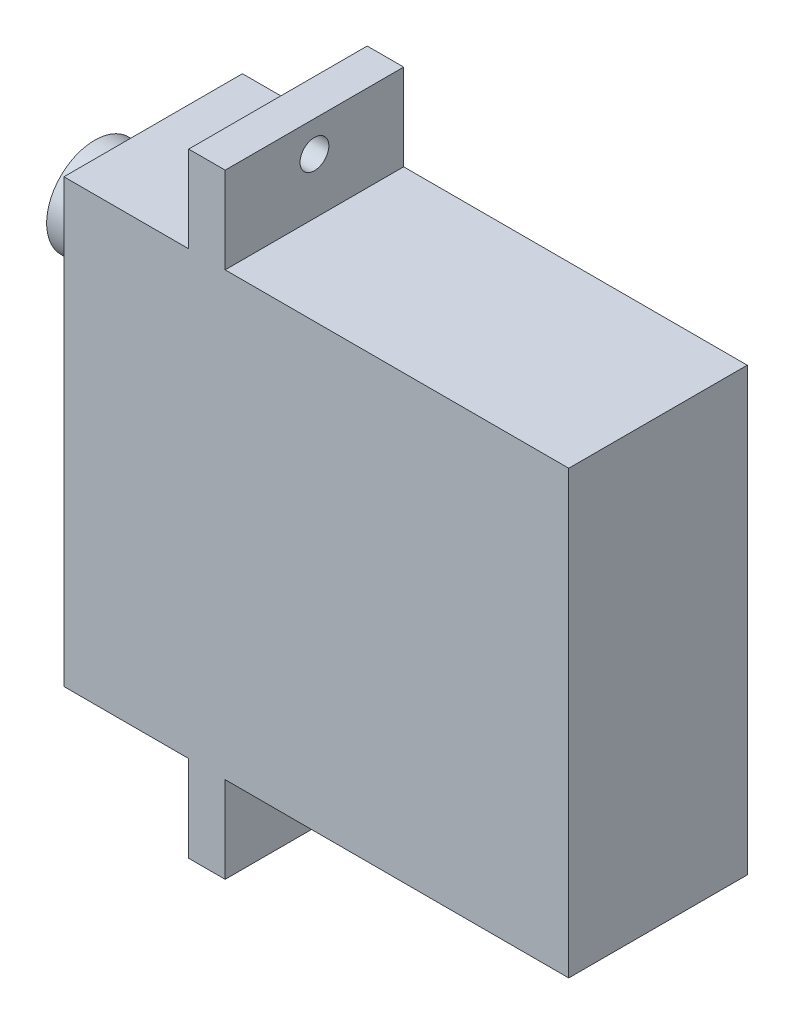
ISO-10303-21;
HEADER;
FILE_DESCRIPTION(('STEP AP214'),'2;1');
FILE_NAME('part.step','',(''),(''),'','','');
FILE_SCHEMA(('AUTOMOTIVE_DESIGN { 1 0 10303 214 1 1 1 1 }'));
ENDSEC;
DATA;
#1=APPLICATION_CONTEXT('core data for automotive mechanical design processes');
#2=APPLICATION_PROTOCOL_DEFINITION('international standard','automotive_design',2000,#1);
#3=PRODUCT_CONTEXT('',#1,'mechanical');
#4=PRODUCT('Part','Part','',(#3));
#5=PRODUCT_RELATED_PRODUCT_CATEGORY('part','',(#4));
#6=PRODUCT_DEFINITION_FORMATION('','',#4);
#7=PRODUCT_DEFINITION_CONTEXT('part definition',#1,'design');
#8=PRODUCT_DEFINITION('design','',#6,#7);
#9=PRODUCT_DEFINITION_SHAPE('','',#8);
#10=(LENGTH_UNIT() NAMED_UNIT(*) SI_UNIT(.MILLI.,.METRE.));
#11=(NAMED_UNIT(*) PLANE_ANGLE_UNIT() SI_UNIT($,.RADIAN.));
#12=(NAMED_UNIT(*) SI_UNIT($,.STERADIAN.) SOLID_ANGLE_UNIT());
#13=UNCERTAINTY_MEASURE_WITH_UNIT(LENGTH_MEASURE(1.E-05),#10,'distance_accuracy_value','');
#14=(GEOMETRIC_REPRESENTATION_CONTEXT(3) GLOBAL_UNCERTAINTY_ASSIGNED_CONTEXT((#13)) GLOBAL_UNIT_ASSIGNED_CONTEXT((#10,
#11,#12)) REPRESENTATION_CONTEXT('',''));
#15=CARTESIAN_POINT('',(0.,0.,0.));
#16=DIRECTION('',(0.,0.,1.));
#17=DIRECTION('',(1.,0.,0.));
#18=AXIS2_PLACEMENT_3D('',#15,#16,#17);
#19=CARTESIAN_POINT('',(-4.75000000000001,11.5,4.65));
#20=DIRECTION('',(0.,-1.,0.));
#21=DIRECTION('',(1.,0.,0.));
#22=AXIS2_PLACEMENT_3D('',#19,#20,#21);
#23=PLANE('',#22);
#24=DIRECTION('',(-1.,0.,0.));
#25=VECTOR('',#24,1.);
#26=CARTESIAN_POINT('',(-4.75000000000001,11.5,-4.65));
#27=LINE('',#26,#25);
#28=CARTESIAN_POINT('',(13.15,11.5,-4.65));
#29=VERTEX_POINT('',#28);
#30=CARTESIAN_POINT('',(-4.75000000000001,11.5,-4.65));
#31=VERTEX_POINT('',#30);
#32=EDGE_CURVE('E160',#29,#31,#27,.T.);
#33=ORIENTED_EDGE('',*,*,#32,.T.);
#34=DIRECTION('',(0.,0.,-1.));
#35=VECTOR('',#34,1.);
#36=CARTESIAN_POINT('',(-4.75000000000001,11.5,4.65));
#37=LINE('',#36,#35);
#38=CARTESIAN_POINT('',(-4.75000000000001,11.5,4.65));
#39=VERTEX_POINT('',#38);
#40=EDGE_CURVE('E11',#39,#31,#37,.T.);
#41=ORIENTED_EDGE('',*,*,#40,.F.);
#42=DIRECTION('',(-1.,0.,0.));
#43=VECTOR('',#42,1.);
#44=CARTESIAN_POINT('',(-4.75000000000001,11.5,4.65));
#45=LINE('',#44,#43);
#46=CARTESIAN_POINT('',(13.15,11.5,4.65));
#47=VERTEX_POINT('',#46);
#48=EDGE_CURVE('E183',#47,#39,#45,.T.);
#49=ORIENTED_EDGE('',*,*,#48,.F.);
#50=DIRECTION('',(0.,0.,-1.));
#51=VECTOR('',#50,1.);
#52=CARTESIAN_POINT('',(13.15,11.5,4.65));
#53=LINE('',#52,#51);
#54=EDGE_CURVE('E156',#47,#29,#53,.T.);
#55=ORIENTED_EDGE('',*,*,#54,.T.);
#56=EDGE_LOOP('',(#33,#41,#49,#55));
#57=FACE_BOUND('',#56,.T.);
#58=ADVANCED_FACE('F39',(#57),#23,.F.);
#59=CARTESIAN_POINT('',(-4.75000000000001,11.5,4.65));
#60=DIRECTION('',(-1.,0.,0.));
#61=DIRECTION('',(0.,0.,1.));
#62=AXIS2_PLACEMENT_3D('',#59,#60,#61);
#63=PLANE('',#62);
#64=CARTESIAN_POINT('',(-4.75000000000001,14.4,0.));
#65=DIRECTION('',(-1.,0.,0.));
#66=DIRECTION('',(0.,0.,1.));
#67=AXIS2_PLACEMENT_3D('',#64,#65,#66);
#68=CIRCLE('',#67,0.750000000000001);
#69=CARTESIAN_POINT('',(-4.75000000000001,14.4,0.750000000000001));
#70=VERTEX_POINT('',#69);
#71=EDGE_CURVE('E300',#70,#70,#68,.T.);
#72=ORIENTED_EDGE('',*,*,#71,.T.);
#73=EDGE_LOOP('',(#72));
#74=FACE_BOUND('',#73,.T.);
#75=DIRECTION('',(0.,1.,0.));
#76=VECTOR('',#75,1.);
#77=CARTESIAN_POINT('',(-4.75000000000001,11.5,-4.65));
#78=LINE('',#77,#76);
#79=CARTESIAN_POINT('',(-4.75000000000001,16.,-4.65));
#80=VERTEX_POINT('',#79);
#81=EDGE_CURVE('E163',#31,#80,#78,.T.);
#82=ORIENTED_EDGE('',*,*,#81,.T.);
#83=DIRECTION('',(0.,0.,-1.));
#84=VECTOR('',#83,1.);
#85=CARTESIAN_POINT('',(-4.75000000000001,16.,4.65));
#86=LINE('',#85,#84);
#87=CARTESIAN_POINT('',(-4.75000000000001,16.,4.65));
#88=VERTEX_POINT('',#87);
#89=EDGE_CURVE('E48',#88,#80,#86,.T.);
#90=ORIENTED_EDGE('',*,*,#89,.F.);
#91=DIRECTION('',(0.,1.,0.));
#92=VECTOR('',#91,1.);
#93=CARTESIAN_POINT('',(-4.75000000000001,11.5,4.65));
#94=LINE('',#93,#92);
#95=EDGE_CURVE('E111',#39,#88,#94,.T.);
#96=ORIENTED_EDGE('',*,*,#95,.F.);
#97=ORIENTED_EDGE('',*,*,#40,.T.);
#98=EDGE_LOOP('',(#82,#90,#96,#97));
#99=FACE_BOUND('',#98,.T.);
#100=ADVANCED_FACE('F262',(#74,#99),#63,.F.);
#101=CARTESIAN_POINT('',(-4.75000000000001,16.,4.65));
#102=DIRECTION('',(0.,-1.,0.));
#103=DIRECTION('',(1.,0.,0.));
#104=AXIS2_PLACEMENT_3D('',#101,#102,#103);
#105=PLANE('',#104);
#106=DIRECTION('',(-1.,0.,0.));
#107=VECTOR('',#106,1.);
#108=CARTESIAN_POINT('',(-4.75000000000001,16.,-4.65));
#109=LINE('',#108,#107);
#110=CARTESIAN_POINT('',(-6.65,16.,-4.65));
#111=VERTEX_POINT('',#110);
#112=EDGE_CURVE('E166',#80,#111,#109,.T.);
#113=ORIENTED_EDGE('',*,*,#112,.T.);
#114=DIRECTION('',(0.,0.,-1.));
#115=VECTOR('',#114,1.);
#116=CARTESIAN_POINT('',(-6.65,16.,4.65));
#117=LINE('',#116,#115);
#118=CARTESIAN_POINT('',(-6.65,16.,4.65));
#119=VERTEX_POINT('',#118);
#120=EDGE_CURVE('E202',#119,#111,#117,.T.);
#121=ORIENTED_EDGE('',*,*,#120,.F.);
#122=DIRECTION('',(-1.,0.,0.));
#123=VECTOR('',#122,1.);
#124=CARTESIAN_POINT('',(-4.75000000000001,16.,4.65));
#125=LINE('',#124,#123);
#126=EDGE_CURVE('E211',#88,#119,#125,.T.);
#127=ORIENTED_EDGE('',*,*,#126,.F.);
#128=ORIENTED_EDGE('',*,*,#89,.T.);
#129=EDGE_LOOP('',(#113,#121,#127,#128));
#130=FACE_BOUND('',#129,.T.);
#131=ADVANCED_FACE('F209',(#130),#105,.F.);
#132=CARTESIAN_POINT('',(-6.65,16.,4.65));
#133=DIRECTION('',(1.,0.,0.));
#134=DIRECTION('',(0.,1.,0.));
#135=AXIS2_PLACEMENT_3D('',#132,#133,#134);
#136=PLANE('',#135);
#137=CARTESIAN_POINT('',(-6.65,14.4,0.));
#138=DIRECTION('',(-1.,0.,0.));
#139=DIRECTION('',(0.,-1.,0.));
#140=AXIS2_PLACEMENT_3D('',#137,#138,#139);
#141=CIRCLE('',#140,0.750000000000001);
#142=CARTESIAN_POINT('',(-6.65,13.65,0.));
#143=VERTEX_POINT('',#142);
#144=EDGE_CURVE('E301',#143,#143,#141,.T.);
#145=ORIENTED_EDGE('',*,*,#144,.F.);
#146=EDGE_LOOP('',(#145));
#147=FACE_BOUND('',#146,.T.);
#148=DIRECTION('',(0.,-1.,0.));
#149=VECTOR('',#148,1.);
#150=CARTESIAN_POINT('',(-6.65,16.,-4.65));
#151=LINE('',#150,#149);
#152=CARTESIAN_POINT('',(-6.65,11.5,-4.65));
#153=VERTEX_POINT('',#152);
#154=EDGE_CURVE('E168',#111,#153,#151,.T.);
#155=ORIENTED_EDGE('',*,*,#154,.T.);
#156=DIRECTION('',(0.,0.,-1.));
#157=VECTOR('',#156,1.);
#158=CARTESIAN_POINT('',(-6.65,11.5,4.65));
#159=LINE('',#158,#157);
#160=CARTESIAN_POINT('',(-6.65,11.5,4.65));
#161=VERTEX_POINT('',#160);
#162=EDGE_CURVE('E199',#161,#153,#159,.T.);
#163=ORIENTED_EDGE('',*,*,#162,.F.);
#164=DIRECTION('',(0.,-1.,0.));
#165=VECTOR('',#164,1.);
#166=CARTESIAN_POINT('',(-6.65,16.,4.65));
#167=LINE('',#166,#165);
#168=EDGE_CURVE('E229',#119,#161,#167,.T.);
#169=ORIENTED_EDGE('',*,*,#168,.F.);
#170=ORIENTED_EDGE('',*,*,#120,.T.);
#171=EDGE_LOOP('',(#155,#163,#169,#170));
#172=FACE_BOUND('',#171,.T.);
#173=ADVANCED_FACE('F220',(#147,#172),#136,.F.);
#174=CARTESIAN_POINT('',(-13.15,11.5,4.65));
#175=DIRECTION('',(0.,-1.,0.));
#176=DIRECTION('',(0.,0.,-1.));
#177=AXIS2_PLACEMENT_3D('',#174,#175,#176);
#178=PLANE('',#177);
#179=DIRECTION('',(-1.,0.,0.));
#180=VECTOR('',#179,1.);
#181=CARTESIAN_POINT('',(-13.15,11.5,-4.65));
#182=LINE('',#181,#180);
#183=CARTESIAN_POINT('',(-13.15,11.5,-4.65));
#184=VERTEX_POINT('',#183);
#185=EDGE_CURVE('E170',#153,#184,#182,.T.);
#186=ORIENTED_EDGE('',*,*,#185,.T.);
#187=DIRECTION('',(0.,0.,-1.));
#188=VECTOR('',#187,1.);
#189=CARTESIAN_POINT('',(-13.15,11.5,4.65));
#190=LINE('',#189,#188);
#191=CARTESIAN_POINT('',(-13.15,11.5,4.65));
#192=VERTEX_POINT('',#191);
#193=EDGE_CURVE('E196',#192,#184,#190,.T.);
#194=ORIENTED_EDGE('',*,*,#193,.F.);
#195=DIRECTION('',(-1.,0.,0.));
#196=VECTOR('',#195,1.);
#197=CARTESIAN_POINT('',(-13.15,11.5,4.65));
#198=LINE('',#197,#196);
#199=EDGE_CURVE('E226',#161,#192,#198,.T.);
#200=ORIENTED_EDGE('',*,*,#199,.F.);
#201=ORIENTED_EDGE('',*,*,#162,.T.);
#202=EDGE_LOOP('',(#186,#194,#200,#201));
#203=FACE_BOUND('',#202,.T.);
#204=ADVANCED_FACE('F224',(#203),#178,.F.);
#205=CARTESIAN_POINT('',(-13.15,-11.5,4.65));
#206=DIRECTION('',(1.,0.,0.));
#207=DIRECTION('',(0.,0.,-1.));
#208=AXIS2_PLACEMENT_3D('',#205,#206,#207);
#209=PLANE('',#208);
#210=CARTESIAN_POINT('',(-13.15,6.8,0.));
#211=DIRECTION('',(1.,0.,0.));
#212=DIRECTION('',(0.,0.,-1.));
#213=AXIS2_PLACEMENT_3D('',#210,#211,#212);
#214=CIRCLE('',#213,2.5);
#215=CARTESIAN_POINT('',(-13.15,6.8,-2.5));
#216=VERTEX_POINT('',#215);
#217=EDGE_CURVE('E302',#216,#216,#214,.T.);
#218=ORIENTED_EDGE('',*,*,#217,.T.);
#219=EDGE_LOOP('',(#218));
#220=FACE_BOUND('',#219,.T.);
#221=DIRECTION('',(0.,-1.,0.));
#222=VECTOR('',#221,1.);
#223=CARTESIAN_POINT('',(-13.15,-11.5,-4.65));
#224=LINE('',#223,#222);
#225=CARTESIAN_POINT('',(-13.15,-11.5,-4.65));
#226=VERTEX_POINT('',#225);
#227=EDGE_CURVE('E172',#184,#226,#224,.T.);
#228=ORIENTED_EDGE('',*,*,#227,.T.);
#229=DIRECTION('',(0.,0.,-1.));
#230=VECTOR('',#229,1.);
#231=CARTESIAN_POINT('',(-13.15,-11.5,4.65));
#232=LINE('',#231,#230);
#233=CARTESIAN_POINT('',(-13.15,-11.5,4.65));
#234=VERTEX_POINT('',#233);
#235=EDGE_CURVE('E193',#234,#226,#232,.T.);
#236=ORIENTED_EDGE('',*,*,#235,.F.);
#237=DIRECTION('',(0.,-1.,0.));
#238=VECTOR('',#237,1.);
#239=CARTESIAN_POINT('',(-13.15,-11.5,4.65));
#240=LINE('',#239,#238);
#241=EDGE_CURVE('E228',#192,#234,#240,.T.);
#242=ORIENTED_EDGE('',*,*,#241,.F.);
#243=ORIENTED_EDGE('',*,*,#193,.T.);
#244=EDGE_LOOP('',(#228,#236,#242,#243));
#245=FACE_BOUND('',#244,.T.);
#246=ADVANCED_FACE('F279',(#220,#245),#209,.F.);
#247=CARTESIAN_POINT('',(-13.15,-11.5,4.65));
#248=DIRECTION('',(0.,1.,0.));
#249=DIRECTION('',(0.,0.,1.));
#250=AXIS2_PLACEMENT_3D('',#247,#248,#249);
#251=PLANE('',#250);
#252=DIRECTION('',(1.,0.,0.));
#253=VECTOR('',#252,1.);
#254=CARTESIAN_POINT('',(-13.15,-11.5,-4.65));
#255=LINE('',#254,#253);
#256=CARTESIAN_POINT('',(-6.65,-11.5,-4.65));
#257=VERTEX_POINT('',#256);
#258=EDGE_CURVE('E174',#226,#257,#255,.T.);
#259=ORIENTED_EDGE('',*,*,#258,.T.);
#260=DIRECTION('',(0.,0.,-1.));
#261=VECTOR('',#260,1.);
#262=CARTESIAN_POINT('',(-6.65,-11.5,4.65));
#263=LINE('',#262,#261);
#264=CARTESIAN_POINT('',(-6.65,-11.5,4.65));
#265=VERTEX_POINT('',#264);
#266=EDGE_CURVE('E190',#265,#257,#263,.T.);
#267=ORIENTED_EDGE('',*,*,#266,.F.);
#268=DIRECTION('',(1.,0.,0.));
#269=VECTOR('',#268,1.);
#270=CARTESIAN_POINT('',(-13.15,-11.5,4.65));
#271=LINE('',#270,#269);
#272=EDGE_CURVE('E231',#234,#265,#271,.T.);
#273=ORIENTED_EDGE('',*,*,#272,.F.);
#274=ORIENTED_EDGE('',*,*,#235,.T.);
#275=EDGE_LOOP('',(#259,#267,#273,#274));
#276=FACE_BOUND('',#275,.T.);
#277=ADVANCED_FACE('F282',(#276),#251,.F.);
#278=CARTESIAN_POINT('',(-6.65,-16.,4.65));
#279=DIRECTION('',(1.,0.,0.));
#280=DIRECTION('',(0.,0.,-1.));
#281=AXIS2_PLACEMENT_3D('',#278,#279,#280);
#282=PLANE('',#281);
#283=CARTESIAN_POINT('',(-6.65,-14.4,0.));
#284=DIRECTION('',(-1.,0.,0.));
#285=DIRECTION('',(0.,-1.,0.));
#286=AXIS2_PLACEMENT_3D('',#283,#284,#285);
#287=CIRCLE('',#286,0.750000000000001);
#288=CARTESIAN_POINT('',(-6.65,-15.15,0.));
#289=VERTEX_POINT('',#288);
#290=EDGE_CURVE('E305',#289,#289,#287,.T.);
#291=ORIENTED_EDGE('',*,*,#290,.F.);
#292=EDGE_LOOP('',(#291));
#293=FACE_BOUND('',#292,.T.);
#294=DIRECTION('',(0.,-1.,0.));
#295=VECTOR('',#294,1.);
#296=CARTESIAN_POINT('',(-6.65,-16.,-4.65));
#297=LINE('',#296,#295);
#298=CARTESIAN_POINT('',(-6.65,-16.,-4.65));
#299=VERTEX_POINT('',#298);
#300=EDGE_CURVE('E176',#257,#299,#297,.T.);
#301=ORIENTED_EDGE('',*,*,#300,.T.);
#302=DIRECTION('',(0.,0.,-1.));
#303=VECTOR('',#302,1.);
#304=CARTESIAN_POINT('',(-6.65,-16.,4.65));
#305=LINE('',#304,#303);
#306=CARTESIAN_POINT('',(-6.65,-16.,4.65));
#307=VERTEX_POINT('',#306);
#308=EDGE_CURVE('E187',#307,#299,#305,.T.);
#309=ORIENTED_EDGE('',*,*,#308,.F.);
#310=DIRECTION('',(0.,-1.,0.));
#311=VECTOR('',#310,1.);
#312=CARTESIAN_POINT('',(-6.65,-16.,4.65));
#313=LINE('',#312,#311);
#314=EDGE_CURVE('E237',#265,#307,#313,.T.);
#315=ORIENTED_EDGE('',*,*,#314,.F.);
#316=ORIENTED_EDGE('',*,*,#266,.T.);
#317=EDGE_LOOP('',(#301,#309,#315,#316));
#318=FACE_BOUND('',#317,.T.);
#319=ADVANCED_FACE('F243',(#293,#318),#282,.F.);
#320=CARTESIAN_POINT('',(-4.75000000000001,-16.,4.65));
#321=DIRECTION('',(0.,1.,0.));
#322=DIRECTION('',(-1.,0.,0.));
#323=AXIS2_PLACEMENT_3D('',#320,#321,#322);
#324=PLANE('',#323);
#325=DIRECTION('',(1.,0.,0.));
#326=VECTOR('',#325,1.);
#327=CARTESIAN_POINT('',(-4.75000000000001,-16.,-4.65));
#328=LINE('',#327,#326);
#329=CARTESIAN_POINT('',(-4.75000000000001,-16.,-4.65));
#330=VERTEX_POINT('',#329);
#331=EDGE_CURVE('E178',#299,#330,#328,.T.);
#332=ORIENTED_EDGE('',*,*,#331,.T.);
#333=DIRECTION('',(0.,0.,-1.));
#334=VECTOR('',#333,1.);
#335=CARTESIAN_POINT('',(-4.75000000000001,-16.,4.65));
#336=LINE('',#335,#334);
#337=CARTESIAN_POINT('',(-4.75000000000001,-16.,4.65));
#338=VERTEX_POINT('',#337);
#339=EDGE_CURVE('E151',#338,#330,#336,.T.);
#340=ORIENTED_EDGE('',*,*,#339,.F.);
#341=DIRECTION('',(1.,0.,0.));
#342=VECTOR('',#341,1.);
#343=CARTESIAN_POINT('',(-4.75000000000001,-16.,4.65));
#344=LINE('',#343,#342);
#345=EDGE_CURVE('E142',#307,#338,#344,.T.);
#346=ORIENTED_EDGE('',*,*,#345,.F.);
#347=ORIENTED_EDGE('',*,*,#308,.T.);
#348=EDGE_LOOP('',(#332,#340,#346,#347));
#349=FACE_BOUND('',#348,.T.);
#350=ADVANCED_FACE('F247',(#349),#324,.F.);
#351=CARTESIAN_POINT('',(-4.75000000000001,-11.5,4.65));
#352=DIRECTION('',(-1.,0.,0.));
#353=DIRECTION('',(0.,0.,1.));
#354=AXIS2_PLACEMENT_3D('',#351,#352,#353);
#355=PLANE('',#354);
#356=CARTESIAN_POINT('',(-4.75000000000001,-14.4,0.));
#357=DIRECTION('',(-1.,0.,0.));
#358=DIRECTION('',(0.,0.,1.));
#359=AXIS2_PLACEMENT_3D('',#356,#357,#358);
#360=CIRCLE('',#359,0.750000000000001);
#361=CARTESIAN_POINT('',(-4.75000000000001,-14.4,0.750000000000004));
#362=VERTEX_POINT('',#361);
#363=EDGE_CURVE('E42',#362,#362,#360,.T.);
#364=ORIENTED_EDGE('',*,*,#363,.T.);
#365=EDGE_LOOP('',(#364));
#366=FACE_BOUND('',#365,.T.);
#367=DIRECTION('',(0.,1.,0.));
#368=VECTOR('',#367,1.);
#369=CARTESIAN_POINT('',(-4.75000000000001,-11.5,-4.65));
#370=LINE('',#369,#368);
#371=CARTESIAN_POINT('',(-4.75000000000001,-11.5,-4.65));
#372=VERTEX_POINT('',#371);
#373=EDGE_CURVE('E150',#330,#372,#370,.T.);
#374=ORIENTED_EDGE('',*,*,#373,.T.);
#375=DIRECTION('',(0.,0.,-1.));
#376=VECTOR('',#375,1.);
#377=CARTESIAN_POINT('',(-4.75000000000001,-11.5,4.65));
#378=LINE('',#377,#376);
#379=CARTESIAN_POINT('',(-4.75000000000001,-11.5,4.65));
#380=VERTEX_POINT('',#379);
#381=EDGE_CURVE('E147',#380,#372,#378,.T.);
#382=ORIENTED_EDGE('',*,*,#381,.F.);
#383=DIRECTION('',(0.,1.,0.));
#384=VECTOR('',#383,1.);
#385=CARTESIAN_POINT('',(-4.75000000000001,-11.5,4.65));
#386=LINE('',#385,#384);
#387=EDGE_CURVE('E136',#338,#380,#386,.T.);
#388=ORIENTED_EDGE('',*,*,#387,.F.);
#389=ORIENTED_EDGE('',*,*,#339,.T.);
#390=EDGE_LOOP('',(#374,#382,#388,#389));
#391=FACE_BOUND('',#390,.T.);
#392=ADVANCED_FACE('F148',(#366,#391),#355,.F.);
#393=CARTESIAN_POINT('',(-4.75000000000001,-11.5,4.65));
#394=DIRECTION('',(0.,1.,0.));
#395=DIRECTION('',(-1.,0.,0.));
#396=AXIS2_PLACEMENT_3D('',#393,#394,#395);
#397=PLANE('',#396);
#398=DIRECTION('',(1.,0.,0.));
#399=VECTOR('',#398,1.);
#400=CARTESIAN_POINT('',(-4.75000000000001,-11.5,-4.65));
#401=LINE('',#400,#399);
#402=CARTESIAN_POINT('',(13.15,-11.5,-4.65));
#403=VERTEX_POINT('',#402);
#404=EDGE_CURVE('E97',#372,#403,#401,.T.);
#405=ORIENTED_EDGE('',*,*,#404,.T.);
#406=DIRECTION('',(0.,0.,-1.));
#407=VECTOR('',#406,1.);
#408=CARTESIAN_POINT('',(13.15,-11.5,4.65));
#409=LINE('',#408,#407);
#410=CARTESIAN_POINT('',(13.15,-11.5,4.65));
#411=VERTEX_POINT('',#410);
#412=EDGE_CURVE('E152',#411,#403,#409,.T.);
#413=ORIENTED_EDGE('',*,*,#412,.F.);
#414=DIRECTION('',(1.,0.,0.));
#415=VECTOR('',#414,1.);
#416=CARTESIAN_POINT('',(-4.75000000000001,-11.5,4.65));
#417=LINE('',#416,#415);
#418=EDGE_CURVE('E140',#380,#411,#417,.T.);
#419=ORIENTED_EDGE('',*,*,#418,.F.);
#420=ORIENTED_EDGE('',*,*,#381,.T.);
#421=EDGE_LOOP('',(#405,#413,#419,#420));
#422=FACE_BOUND('',#421,.T.);
#423=ADVANCED_FACE('F154',(#422),#397,.F.);
#424=CARTESIAN_POINT('',(13.15,-11.5,4.65));
#425=DIRECTION('',(-1.,0.,0.));
#426=DIRECTION('',(0.,0.,1.));
#427=AXIS2_PLACEMENT_3D('',#424,#425,#426);
#428=PLANE('',#427);
#429=DIRECTION('',(0.,1.,0.));
#430=VECTOR('',#429,1.);
#431=CARTESIAN_POINT('',(13.15,-11.5,-4.65));
#432=LINE('',#431,#430);
#433=EDGE_CURVE('E103',#403,#29,#432,.T.);
#434=ORIENTED_EDGE('',*,*,#433,.T.);
#435=ORIENTED_EDGE('',*,*,#54,.F.);
#436=DIRECTION('',(0.,1.,0.));
#437=VECTOR('',#436,1.);
#438=CARTESIAN_POINT('',(13.15,-11.5,4.65));
#439=LINE('',#438,#437);
#440=EDGE_CURVE('E56',#411,#47,#439,.T.);
#441=ORIENTED_EDGE('',*,*,#440,.F.);
#442=ORIENTED_EDGE('',*,*,#412,.T.);
#443=EDGE_LOOP('',(#434,#435,#441,#442));
#444=FACE_BOUND('',#443,.T.);
#445=ADVANCED_FACE('F251',(#444),#428,.F.);
#446=CARTESIAN_POINT('',(0.,0.,4.65));
#447=DIRECTION('',(0.,0.,1.));
#448=DIRECTION('',(1.,0.,0.));
#449=AXIS2_PLACEMENT_3D('',#446,#447,#448);
#450=PLANE('',#449);
#451=ORIENTED_EDGE('',*,*,#48,.T.);
#452=ORIENTED_EDGE('',*,*,#95,.T.);
#453=ORIENTED_EDGE('',*,*,#126,.T.);
#454=ORIENTED_EDGE('',*,*,#168,.T.);
#455=ORIENTED_EDGE('',*,*,#199,.T.);
#456=ORIENTED_EDGE('',*,*,#241,.T.);
#457=ORIENTED_EDGE('',*,*,#272,.T.);
#458=ORIENTED_EDGE('',*,*,#314,.T.);
#459=ORIENTED_EDGE('',*,*,#345,.T.);
#460=ORIENTED_EDGE('',*,*,#387,.T.);
#461=ORIENTED_EDGE('',*,*,#418,.T.);
#462=ORIENTED_EDGE('',*,*,#440,.T.);
#463=EDGE_LOOP('',(#451,#452,#453,#454,#455,#456,#457,#458,#459,#460,#461,#462));
#464=FACE_BOUND('',#463,.T.);
#465=ADVANCED_FACE('F138',(#464),#450,.T.);
#466=CARTESIAN_POINT('',(0.,0.,-4.65));
#467=DIRECTION('',(0.,0.,1.));
#468=DIRECTION('',(1.,0.,0.));
#469=AXIS2_PLACEMENT_3D('',#466,#467,#468);
#470=PLANE('',#469);
#471=ORIENTED_EDGE('',*,*,#32,.F.);
#472=ORIENTED_EDGE('',*,*,#433,.F.);
#473=ORIENTED_EDGE('',*,*,#404,.F.);
#474=ORIENTED_EDGE('',*,*,#373,.F.);
#475=ORIENTED_EDGE('',*,*,#331,.F.);
#476=ORIENTED_EDGE('',*,*,#300,.F.);
#477=ORIENTED_EDGE('',*,*,#258,.F.);
#478=ORIENTED_EDGE('',*,*,#227,.F.);
#479=ORIENTED_EDGE('',*,*,#185,.F.);
#480=ORIENTED_EDGE('',*,*,#154,.F.);
#481=ORIENTED_EDGE('',*,*,#112,.F.);
#482=ORIENTED_EDGE('',*,*,#81,.F.);
#483=EDGE_LOOP('',(#471,#472,#473,#474,#475,#476,#477,#478,#479,#480,#481,#482));
#484=FACE_BOUND('',#483,.T.);
#485=ADVANCED_FACE('F215',(#484),#470,.F.);
#486=CARTESIAN_POINT('',(-16.2,6.8,0.));
#487=DIRECTION('',(-1.,0.,0.));
#488=DIRECTION('',(0.,0.,1.));
#489=AXIS2_PLACEMENT_3D('',#486,#487,#488);
#490=PLANE('',#489);
#491=CARTESIAN_POINT('',(-16.2,6.8,0.));
#492=DIRECTION('',(1.,0.,0.));
#493=DIRECTION('',(0.,0.,-1.));
#494=AXIS2_PLACEMENT_3D('',#491,#492,#493);
#495=CIRCLE('',#494,2.5);
#496=CARTESIAN_POINT('',(-16.2,6.8,-2.5));
#497=VERTEX_POINT('',#496);
#498=EDGE_CURVE('E164',#497,#497,#495,.T.);
#499=ORIENTED_EDGE('',*,*,#498,.F.);
#500=EDGE_LOOP('',(#499));
#501=FACE_BOUND('',#500,.T.);
#502=ADVANCED_FACE('F322',(#501),#490,.T.);
#503=CARTESIAN_POINT('',(-13.15,6.8,0.));
#504=DIRECTION('',(1.,0.,0.));
#505=DIRECTION('',(0.,0.,-1.));
#506=AXIS2_PLACEMENT_3D('',#503,#504,#505);
#507=CYLINDRICAL_SURFACE('',#506,2.5);
#508=ORIENTED_EDGE('',*,*,#498,.T.);
#509=EDGE_LOOP('',(#508));
#510=FACE_BOUND('',#509,.T.);
#511=ORIENTED_EDGE('',*,*,#217,.F.);
#512=EDGE_LOOP('',(#511));
#513=FACE_BOUND('',#512,.T.);
#514=ADVANCED_FACE('F319',(#510,#513),#507,.T.);
#515=CARTESIAN_POINT('',(3.35,-14.4,0.));
#516=DIRECTION('',(-1.,0.,0.));
#517=DIRECTION('',(0.,-1.,0.));
#518=AXIS2_PLACEMENT_3D('',#515,#516,#517);
#519=CYLINDRICAL_SURFACE('',#518,0.750000000000001);
#520=ORIENTED_EDGE('',*,*,#290,.T.);
#521=EDGE_LOOP('',(#520));
#522=FACE_BOUND('',#521,.T.);
#523=ORIENTED_EDGE('',*,*,#363,.F.);
#524=EDGE_LOOP('',(#523));
#525=FACE_BOUND('',#524,.T.);
#526=ADVANCED_FACE('F327',(#522,#525),#519,.F.);
#527=CARTESIAN_POINT('',(3.35,14.4,0.));
#528=DIRECTION('',(-1.,0.,0.));
#529=DIRECTION('',(0.,-1.,0.));
#530=AXIS2_PLACEMENT_3D('',#527,#528,#529);
#531=CYLINDRICAL_SURFACE('',#530,0.750000000000001);
#532=ORIENTED_EDGE('',*,*,#144,.T.);
#533=EDGE_LOOP('',(#532));
#534=FACE_BOUND('',#533,.T.);
#535=ORIENTED_EDGE('',*,*,#71,.F.);
#536=EDGE_LOOP('',(#535));
#537=FACE_BOUND('',#536,.T.);
#538=ADVANCED_FACE('F332',(#534,#537),#531,.F.);
#539=CLOSED_SHELL('',(#58,#100,#131,#173,#204,#246,#277,#319,#350,#392,#423,#445,#465,#485,#502,
#514,#526,#538));
#540=MANIFOLD_SOLID_BREP('B2',#539);
#541=ADVANCED_BREP_SHAPE_REPRESENTATION('',(#18,#540),#14);
#542=SHAPE_DEFINITION_REPRESENTATION(#9,#541);
ENDSEC;
END-ISO-10303-21;
